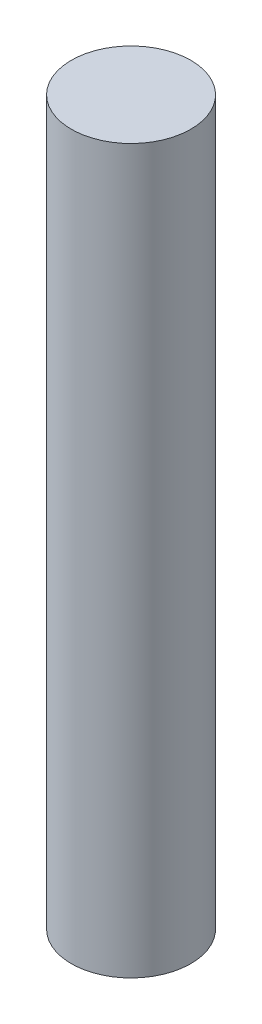
ISO-10303-21;
HEADER;
FILE_DESCRIPTION(('STEP AP214'),'2;1');
FILE_NAME('part.step','',(''),(''),'','','');
FILE_SCHEMA(('AUTOMOTIVE_DESIGN { 1 0 10303 214 1 1 1 1 }'));
ENDSEC;
DATA;
#1=APPLICATION_CONTEXT('core data for automotive mechanical design processes');
#2=APPLICATION_PROTOCOL_DEFINITION('international standard','automotive_design',2000,#1);
#3=PRODUCT_CONTEXT('',#1,'mechanical');
#4=PRODUCT('Part','Part','',(#3));
#5=PRODUCT_RELATED_PRODUCT_CATEGORY('part','',(#4));
#6=PRODUCT_DEFINITION_FORMATION('','',#4);
#7=PRODUCT_DEFINITION_CONTEXT('part definition',#1,'design');
#8=PRODUCT_DEFINITION('design','',#6,#7);
#9=PRODUCT_DEFINITION_SHAPE('','',#8);
#10=(LENGTH_UNIT() NAMED_UNIT(*) SI_UNIT(.MILLI.,.METRE.));
#11=(NAMED_UNIT(*) PLANE_ANGLE_UNIT() SI_UNIT($,.RADIAN.));
#12=(NAMED_UNIT(*) SI_UNIT($,.STERADIAN.) SOLID_ANGLE_UNIT());
#13=UNCERTAINTY_MEASURE_WITH_UNIT(LENGTH_MEASURE(1.E-05),#10,'distance_accuracy_value','');
#14=(GEOMETRIC_REPRESENTATION_CONTEXT(3) GLOBAL_UNCERTAINTY_ASSIGNED_CONTEXT((#13)) GLOBAL_UNIT_ASSIGNED_CONTEXT((#10,
#11,#12)) REPRESENTATION_CONTEXT('',''));
#15=CARTESIAN_POINT('',(0.,0.,0.));
#16=DIRECTION('',(0.,0.,1.));
#17=DIRECTION('',(1.,0.,0.));
#18=AXIS2_PLACEMENT_3D('',#15,#16,#17);
#19=CARTESIAN_POINT('',(0.,0.,0.));
#20=DIRECTION('',(0.,-1.,0.));
#21=DIRECTION('',(0.,0.,-1.));
#22=AXIS2_PLACEMENT_3D('',#19,#20,#21);
#23=PLANE('',#22);
#24=CARTESIAN_POINT('',(0.,0.,0.));
#25=DIRECTION('',(0.,-1.,0.));
#26=DIRECTION('',(0.,0.,-1.));
#27=AXIS2_PLACEMENT_3D('',#24,#25,#26);
#28=CIRCLE('',#27,1.5);
#29=CARTESIAN_POINT('',(0.,0.,-1.5));
#30=VERTEX_POINT('',#29);
#31=EDGE_CURVE('E10',#30,#30,#28,.T.);
#32=ORIENTED_EDGE('',*,*,#31,.T.);
#33=EDGE_LOOP('',(#32));
#34=FACE_BOUND('',#33,.T.);
#35=ADVANCED_FACE('F37',(#34),#23,.T.);
#36=CARTESIAN_POINT('',(0.,0.,0.));
#37=DIRECTION('',(0.,-1.,0.));
#38=DIRECTION('',(0.,0.,-1.));
#39=AXIS2_PLACEMENT_3D('',#36,#37,#38);
#40=CYLINDRICAL_SURFACE('',#39,1.5);
#41=CARTESIAN_POINT('',(0.,18.14,0.));
#42=DIRECTION('',(0.,-1.,0.));
#43=DIRECTION('',(0.,0.,-1.));
#44=AXIS2_PLACEMENT_3D('',#41,#42,#43);
#45=CIRCLE('',#44,1.5);
#46=CARTESIAN_POINT('',(0.,18.14,-1.5));
#47=VERTEX_POINT('',#46);
#48=EDGE_CURVE('E44',#47,#47,#45,.T.);
#49=ORIENTED_EDGE('',*,*,#48,.T.);
#50=EDGE_LOOP('',(#49));
#51=FACE_BOUND('',#50,.T.);
#52=ORIENTED_EDGE('',*,*,#31,.F.);
#53=EDGE_LOOP('',(#52));
#54=FACE_BOUND('',#53,.T.);
#55=ADVANCED_FACE('F51',(#51,#54),#40,.T.);
#56=CARTESIAN_POINT('',(1.5,18.14,0.));
#57=DIRECTION('',(0.,1.,0.));
#58=DIRECTION('',(0.,0.,1.));
#59=AXIS2_PLACEMENT_3D('',#56,#57,#58);
#60=PLANE('',#59);
#61=ORIENTED_EDGE('',*,*,#48,.F.);
#62=EDGE_LOOP('',(#61));
#63=FACE_BOUND('',#62,.T.);
#64=ADVANCED_FACE('F54',(#63),#60,.T.);
#65=CLOSED_SHELL('',(#35,#55,#64));
#66=MANIFOLD_SOLID_BREP('B2',#65);
#67=ADVANCED_BREP_SHAPE_REPRESENTATION('',(#18,#66),#14);
#68=SHAPE_DEFINITION_REPRESENTATION(#9,#67);
ENDSEC;
END-ISO-10303-21;
